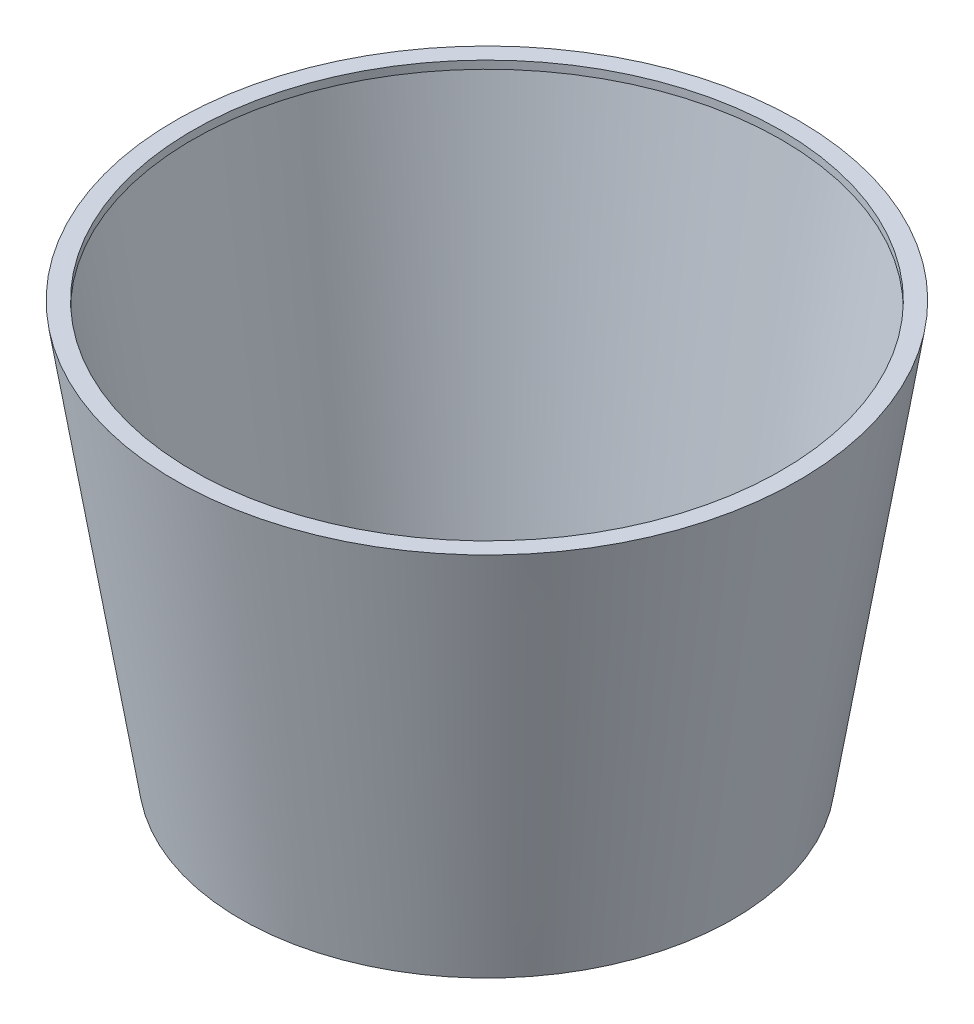
ISO-10303-21;
HEADER;
FILE_DESCRIPTION(('STEP AP214'),'2;1');
FILE_NAME('part.step','',(''),(''),'','','');
FILE_SCHEMA(('AUTOMOTIVE_DESIGN { 1 0 10303 214 1 1 1 1 }'));
ENDSEC;
DATA;
#1=APPLICATION_CONTEXT('core data for automotive mechanical design processes');
#2=APPLICATION_PROTOCOL_DEFINITION('international standard','automotive_design',2000,#1);
#3=PRODUCT_CONTEXT('',#1,'mechanical');
#4=PRODUCT('Part','Part','',(#3));
#5=PRODUCT_RELATED_PRODUCT_CATEGORY('part','',(#4));
#6=PRODUCT_DEFINITION_FORMATION('','',#4);
#7=PRODUCT_DEFINITION_CONTEXT('part definition',#1,'design');
#8=PRODUCT_DEFINITION('design','',#6,#7);
#9=PRODUCT_DEFINITION_SHAPE('','',#8);
#10=(LENGTH_UNIT() NAMED_UNIT(*) SI_UNIT(.MILLI.,.METRE.));
#11=(NAMED_UNIT(*) PLANE_ANGLE_UNIT() SI_UNIT($,.RADIAN.));
#12=(NAMED_UNIT(*) SI_UNIT($,.STERADIAN.) SOLID_ANGLE_UNIT());
#13=UNCERTAINTY_MEASURE_WITH_UNIT(LENGTH_MEASURE(1.E-05),#10,'distance_accuracy_value','');
#14=(GEOMETRIC_REPRESENTATION_CONTEXT(3) GLOBAL_UNCERTAINTY_ASSIGNED_CONTEXT((#13)) GLOBAL_UNIT_ASSIGNED_CONTEXT((#10,
#11,#12)) REPRESENTATION_CONTEXT('',''));
#15=CARTESIAN_POINT('',(0.,0.,0.));
#16=DIRECTION('',(0.,0.,1.));
#17=DIRECTION('',(1.,0.,0.));
#18=AXIS2_PLACEMENT_3D('',#15,#16,#17);
#19=CARTESIAN_POINT('',(38.1,51.,0.));
#20=DIRECTION('',(0.,1.,0.));
#21=DIRECTION('',(0.,0.,1.));
#22=AXIS2_PLACEMENT_3D('',#19,#20,#21);
#23=PLANE('',#22);
#24=CARTESIAN_POINT('',(0.,51.,0.));
#25=DIRECTION('',(0.,-1.,0.));
#26=DIRECTION('',(0.,0.,-1.));
#27=AXIS2_PLACEMENT_3D('',#24,#25,#26);
#28=CIRCLE('',#27,37.1);
#29=CARTESIAN_POINT('',(0.,51.,-37.1));
#30=VERTEX_POINT('',#29);
#31=EDGE_CURVE('E60',#30,#30,#28,.T.);
#32=ORIENTED_EDGE('',*,*,#31,.T.);
#33=EDGE_LOOP('',(#32));
#34=FACE_BOUND('',#33,.T.);
#35=CARTESIAN_POINT('',(0.,51.,0.));
#36=DIRECTION('',(0.,-1.,0.));
#37=DIRECTION('',(0.,0.,-1.));
#38=AXIS2_PLACEMENT_3D('',#35,#36,#37);
#39=CIRCLE('',#38,39.2712723762959);
#40=CARTESIAN_POINT('',(0.,51.,-39.2712723762959));
#41=VERTEX_POINT('',#40);
#42=EDGE_CURVE('E12',#41,#41,#39,.T.);
#43=ORIENTED_EDGE('',*,*,#42,.F.);
#44=EDGE_LOOP('',(#43));
#45=FACE_BOUND('',#44,.T.);
#46=ADVANCED_FACE('F38',(#34,#45),#23,.T.);
#47=CARTESIAN_POINT('',(0.,-1.,0.));
#48=DIRECTION('',(0.,1.,0.));
#49=DIRECTION('',(0.,0.,1.));
#50=AXIS2_PLACEMENT_3D('',#47,#48,#49);
#51=CONICAL_SURFACE('',#50,31.016272376296,0.157436226316679);
#52=ORIENTED_EDGE('',*,*,#42,.T.);
#53=EDGE_LOOP('',(#52));
#54=FACE_BOUND('',#53,.T.);
#55=CARTESIAN_POINT('',(0.,-1.,0.));
#56=DIRECTION('',(0.,-1.,0.));
#57=DIRECTION('',(0.,0.,-1.));
#58=AXIS2_PLACEMENT_3D('',#55,#56,#57);
#59=CIRCLE('',#58,31.016272376296);
#60=CARTESIAN_POINT('',(0.,-1.,-31.016272376296));
#61=VERTEX_POINT('',#60);
#62=EDGE_CURVE('E44',#61,#61,#59,.T.);
#63=ORIENTED_EDGE('',*,*,#62,.F.);
#64=EDGE_LOOP('',(#63));
#65=FACE_BOUND('',#64,.T.);
#66=ADVANCED_FACE('F91',(#54,#65),#51,.T.);
#67=CARTESIAN_POINT('',(0.,-1.,0.));
#68=DIRECTION('',(0.,-1.,0.));
#69=DIRECTION('',(0.,0.,-1.));
#70=AXIS2_PLACEMENT_3D('',#67,#68,#69);
#71=PLANE('',#70);
#72=ORIENTED_EDGE('',*,*,#62,.T.);
#73=EDGE_LOOP('',(#72));
#74=FACE_BOUND('',#73,.T.);
#75=ADVANCED_FACE('F86',(#74),#71,.T.);
#76=CARTESIAN_POINT('',(0.,0.,0.));
#77=DIRECTION('',(0.,-1.,0.));
#78=DIRECTION('',(0.,0.,-1.));
#79=AXIS2_PLACEMENT_3D('',#76,#77,#78);
#80=PLANE('',#79);
#81=CARTESIAN_POINT('',(0.,0.,0.));
#82=DIRECTION('',(0.,-1.,0.));
#83=DIRECTION('',(0.,0.,-1.));
#84=AXIS2_PLACEMENT_3D('',#81,#82,#83);
#85=CIRCLE('',#84,30.1625);
#86=CARTESIAN_POINT('',(0.,0.,-30.1625));
#87=VERTEX_POINT('',#86);
#88=EDGE_CURVE('E48',#87,#87,#85,.T.);
#89=ORIENTED_EDGE('',*,*,#88,.F.);
#90=EDGE_LOOP('',(#89));
#91=FACE_BOUND('',#90,.T.);
#92=ADVANCED_FACE('F81',(#91),#80,.F.);
#93=CARTESIAN_POINT('',(0.,0.,0.));
#94=DIRECTION('',(0.,1.,0.));
#95=DIRECTION('',(0.,0.,1.));
#96=AXIS2_PLACEMENT_3D('',#93,#94,#95);
#97=CONICAL_SURFACE('',#96,30.1625,0.157436226316679);
#98=CARTESIAN_POINT('',(0.,50.,0.));
#99=DIRECTION('',(0.,-1.,0.));
#100=DIRECTION('',(0.,0.,-1.));
#101=AXIS2_PLACEMENT_3D('',#98,#99,#100);
#102=CIRCLE('',#101,38.1);
#103=CARTESIAN_POINT('',(0.,50.,-38.1));
#104=VERTEX_POINT('',#103);
#105=EDGE_CURVE('E52',#104,#104,#102,.T.);
#106=ORIENTED_EDGE('',*,*,#105,.F.);
#107=EDGE_LOOP('',(#106));
#108=FACE_BOUND('',#107,.T.);
#109=ORIENTED_EDGE('',*,*,#88,.T.);
#110=EDGE_LOOP('',(#109));
#111=FACE_BOUND('',#110,.T.);
#112=ADVANCED_FACE('F75',(#108,#111),#97,.F.);
#113=CARTESIAN_POINT('',(38.1,50.,0.));
#114=DIRECTION('',(0.,1.,0.));
#115=DIRECTION('',(0.,0.,1.));
#116=AXIS2_PLACEMENT_3D('',#113,#114,#115);
#117=PLANE('',#116);
#118=CARTESIAN_POINT('',(0.,50.,0.));
#119=DIRECTION('',(0.,-1.,0.));
#120=DIRECTION('',(0.,0.,-1.));
#121=AXIS2_PLACEMENT_3D('',#118,#119,#120);
#122=CIRCLE('',#121,37.1);
#123=CARTESIAN_POINT('',(0.,50.,-37.1));
#124=VERTEX_POINT('',#123);
#125=EDGE_CURVE('E57',#124,#124,#122,.T.);
#126=ORIENTED_EDGE('',*,*,#125,.F.);
#127=EDGE_LOOP('',(#126));
#128=FACE_BOUND('',#127,.T.);
#129=ORIENTED_EDGE('',*,*,#105,.T.);
#130=EDGE_LOOP('',(#129));
#131=FACE_BOUND('',#130,.T.);
#132=ADVANCED_FACE('F69',(#128,#131),#117,.F.);
#133=CARTESIAN_POINT('',(0.,0.,0.));
#134=DIRECTION('',(0.,-1.,0.));
#135=DIRECTION('',(0.,0.,-1.));
#136=AXIS2_PLACEMENT_3D('',#133,#134,#135);
#137=CYLINDRICAL_SURFACE('',#136,37.1);
#138=ORIENTED_EDGE('',*,*,#31,.F.);
#139=EDGE_LOOP('',(#138));
#140=FACE_BOUND('',#139,.T.);
#141=ORIENTED_EDGE('',*,*,#125,.T.);
#142=EDGE_LOOP('',(#141));
#143=FACE_BOUND('',#142,.T.);
#144=ADVANCED_FACE('F66',(#140,#143),#137,.F.);
#145=CLOSED_SHELL('',(#46,#66,#75,#92,#112,#132,#144));
#146=MANIFOLD_SOLID_BREP('B2',#145);
#147=ADVANCED_BREP_SHAPE_REPRESENTATION('',(#18,#146),#14);
#148=SHAPE_DEFINITION_REPRESENTATION(#9,#147);
ENDSEC;
END-ISO-10303-21;
